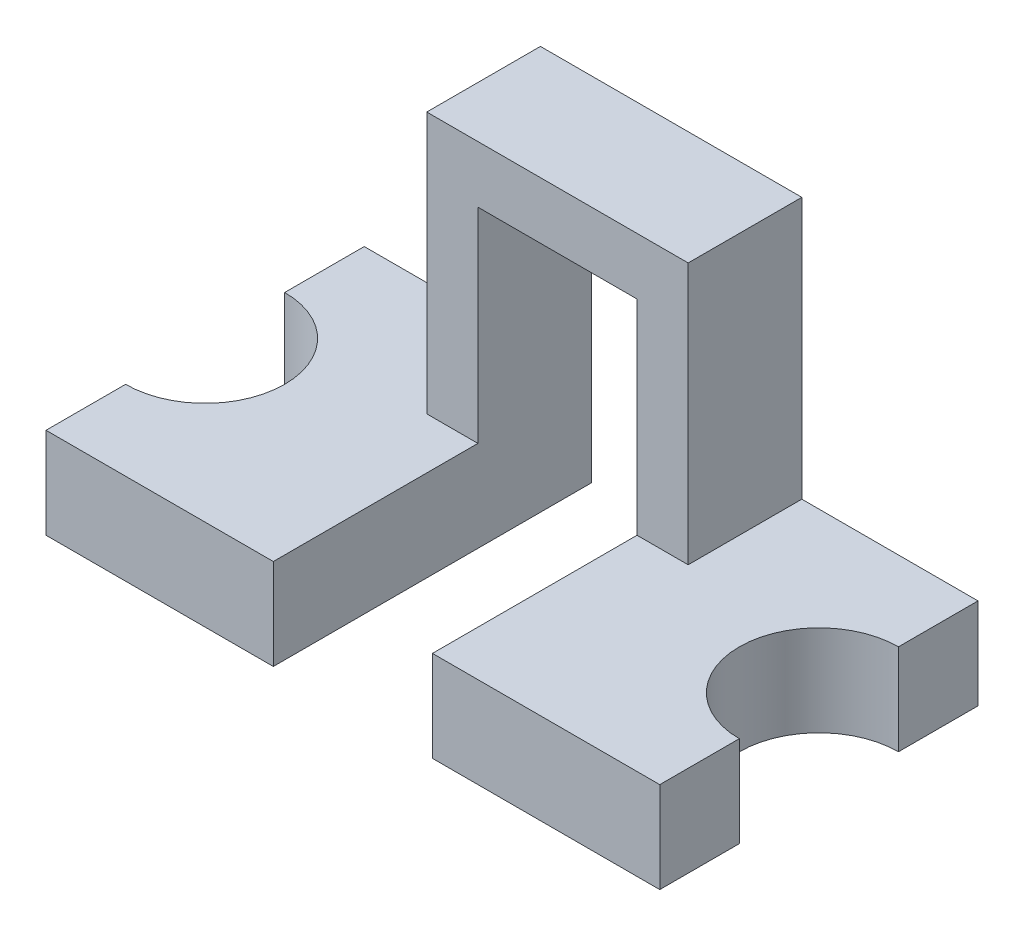
ISO-10303-21;
HEADER;
FILE_DESCRIPTION(('STEP AP214'),'2;1');
FILE_NAME('part.step','',(''),(''),'','','');
FILE_SCHEMA(('AUTOMOTIVE_DESIGN { 1 0 10303 214 1 1 1 1 }'));
ENDSEC;
DATA;
#1=APPLICATION_CONTEXT('core data for automotive mechanical design processes');
#2=APPLICATION_PROTOCOL_DEFINITION('international standard','automotive_design',2000,#1);
#3=PRODUCT_CONTEXT('',#1,'mechanical');
#4=PRODUCT('Part','Part','',(#3));
#5=PRODUCT_RELATED_PRODUCT_CATEGORY('part','',(#4));
#6=PRODUCT_DEFINITION_FORMATION('','',#4);
#7=PRODUCT_DEFINITION_CONTEXT('part definition',#1,'design');
#8=PRODUCT_DEFINITION('design','',#6,#7);
#9=PRODUCT_DEFINITION_SHAPE('','',#8);
#10=(LENGTH_UNIT() NAMED_UNIT(*) SI_UNIT(.MILLI.,.METRE.));
#11=(NAMED_UNIT(*) PLANE_ANGLE_UNIT() SI_UNIT($,.RADIAN.));
#12=(NAMED_UNIT(*) SI_UNIT($,.STERADIAN.) SOLID_ANGLE_UNIT());
#13=UNCERTAINTY_MEASURE_WITH_UNIT(LENGTH_MEASURE(1.E-05),#10,'distance_accuracy_value','');
#14=(GEOMETRIC_REPRESENTATION_CONTEXT(3) GLOBAL_UNCERTAINTY_ASSIGNED_CONTEXT((#13)) GLOBAL_UNIT_ASSIGNED_CONTEXT((#10,
#11,#12)) REPRESENTATION_CONTEXT('',''));
#15=CARTESIAN_POINT('',(0.,0.,0.));
#16=DIRECTION('',(0.,0.,1.));
#17=DIRECTION('',(1.,0.,0.));
#18=AXIS2_PLACEMENT_3D('',#15,#16,#17);
#19=CARTESIAN_POINT('',(7.,8.,0.));
#20=DIRECTION('',(1.,0.,0.));
#21=DIRECTION('',(0.,0.,-1.));
#22=AXIS2_PLACEMENT_3D('',#19,#20,#21);
#23=PLANE('',#22);
#24=DIRECTION('',(0.,0.,1.));
#25=VECTOR('',#24,1.);
#26=CARTESIAN_POINT('',(7.,0.,0.));
#27=LINE('',#26,#25);
#28=CARTESIAN_POINT('',(7.,0.,-28.));
#29=VERTEX_POINT('',#28);
#30=CARTESIAN_POINT('',(7.,0.,0.));
#31=VERTEX_POINT('',#30);
#32=EDGE_CURVE('E273',#29,#31,#27,.T.);
#33=ORIENTED_EDGE('',*,*,#32,.T.);
#34=DIRECTION('',(0.,-1.,0.));
#35=VECTOR('',#34,1.);
#36=CARTESIAN_POINT('',(7.,8.,0.));
#37=LINE('',#36,#35);
#38=CARTESIAN_POINT('',(7.,8.,0.));
#39=VERTEX_POINT('',#38);
#40=EDGE_CURVE('E11',#39,#31,#37,.T.);
#41=ORIENTED_EDGE('',*,*,#40,.F.);
#42=DIRECTION('',(0.,0.,1.));
#43=VECTOR('',#42,1.);
#44=CARTESIAN_POINT('',(7.,8.,0.));
#45=LINE('',#44,#43);
#46=CARTESIAN_POINT('',(7.,8.,-18.));
#47=VERTEX_POINT('',#46);
#48=EDGE_CURVE('E290',#47,#39,#45,.T.);
#49=ORIENTED_EDGE('',*,*,#48,.F.);
#50=DIRECTION('',(0.,1.,0.));
#51=VECTOR('',#50,1.);
#52=CARTESIAN_POINT('',(7.,8.,-18.));
#53=LINE('',#52,#51);
#54=CARTESIAN_POINT('',(7.,26.,-18.));
#55=VERTEX_POINT('',#54);
#56=EDGE_CURVE('E226',#47,#55,#53,.T.);
#57=ORIENTED_EDGE('',*,*,#56,.T.);
#58=DIRECTION('',(0.,0.,-1.));
#59=VECTOR('',#58,1.);
#60=CARTESIAN_POINT('',(7.,26.,-18.));
#61=LINE('',#60,#59);
#62=CARTESIAN_POINT('',(7.,26.,-28.));
#63=VERTEX_POINT('',#62);
#64=EDGE_CURVE('E256',#55,#63,#61,.T.);
#65=ORIENTED_EDGE('',*,*,#64,.T.);
#66=DIRECTION('',(0.,-1.,0.));
#67=VECTOR('',#66,1.);
#68=CARTESIAN_POINT('',(7.,8.,-28.));
#69=LINE('',#68,#67);
#70=EDGE_CURVE('E308',#63,#29,#69,.T.);
#71=ORIENTED_EDGE('',*,*,#70,.T.);
#72=EDGE_LOOP('',(#33,#41,#49,#57,#65,#71));
#73=FACE_BOUND('',#72,.T.);
#74=ADVANCED_FACE('F45',(#73),#23,.F.);
#75=CARTESIAN_POINT('',(7.,8.,0.));
#76=DIRECTION('',(0.,0.,-1.));
#77=DIRECTION('',(-1.,0.,0.));
#78=AXIS2_PLACEMENT_3D('',#75,#76,#77);
#79=PLANE('',#78);
#80=DIRECTION('',(1.,0.,0.));
#81=VECTOR('',#80,1.);
#82=CARTESIAN_POINT('',(7.,0.,0.));
#83=LINE('',#82,#81);
#84=CARTESIAN_POINT('',(27.,0.,0.));
#85=VERTEX_POINT('',#84);
#86=EDGE_CURVE('E312',#31,#85,#83,.T.);
#87=ORIENTED_EDGE('',*,*,#86,.T.);
#88=DIRECTION('',(0.,-1.,0.));
#89=VECTOR('',#88,1.);
#90=CARTESIAN_POINT('',(27.,8.,0.));
#91=LINE('',#90,#89);
#92=CARTESIAN_POINT('',(27.,8.,0.));
#93=VERTEX_POINT('',#92);
#94=EDGE_CURVE('E53',#93,#85,#91,.T.);
#95=ORIENTED_EDGE('',*,*,#94,.F.);
#96=DIRECTION('',(1.,0.,0.));
#97=VECTOR('',#96,1.);
#98=CARTESIAN_POINT('',(7.,8.,0.));
#99=LINE('',#98,#97);
#100=EDGE_CURVE('E293',#39,#93,#99,.T.);
#101=ORIENTED_EDGE('',*,*,#100,.F.);
#102=ORIENTED_EDGE('',*,*,#40,.T.);
#103=EDGE_LOOP('',(#87,#95,#101,#102));
#104=FACE_BOUND('',#103,.T.);
#105=ADVANCED_FACE('F367',(#104),#79,.F.);
#106=CARTESIAN_POINT('',(27.,8.,0.));
#107=DIRECTION('',(-1.,0.,0.));
#108=DIRECTION('',(0.,0.,1.));
#109=AXIS2_PLACEMENT_3D('',#106,#107,#108);
#110=PLANE('',#109);
#111=DIRECTION('',(0.,0.,-1.));
#112=VECTOR('',#111,1.);
#113=CARTESIAN_POINT('',(27.,0.,0.));
#114=LINE('',#113,#112);
#115=CARTESIAN_POINT('',(27.,0.,-7.));
#116=VERTEX_POINT('',#115);
#117=EDGE_CURVE('E315',#85,#116,#114,.T.);
#118=ORIENTED_EDGE('',*,*,#117,.T.);
#119=DIRECTION('',(0.,-1.,0.));
#120=VECTOR('',#119,1.);
#121=CARTESIAN_POINT('',(27.,8.,-7.));
#122=LINE('',#121,#120);
#123=CARTESIAN_POINT('',(27.,8.,-7.));
#124=VERTEX_POINT('',#123);
#125=EDGE_CURVE('E337',#124,#116,#122,.T.);
#126=ORIENTED_EDGE('',*,*,#125,.F.);
#127=DIRECTION('',(0.,0.,-1.));
#128=VECTOR('',#127,1.);
#129=CARTESIAN_POINT('',(27.,8.,0.));
#130=LINE('',#129,#128);
#131=EDGE_CURVE('E297',#93,#124,#130,.T.);
#132=ORIENTED_EDGE('',*,*,#131,.F.);
#133=ORIENTED_EDGE('',*,*,#94,.T.);
#134=EDGE_LOOP('',(#118,#126,#132,#133));
#135=FACE_BOUND('',#134,.T.);
#136=ADVANCED_FACE('F346',(#135),#110,.F.);
#137=CARTESIAN_POINT('',(27.,8.,-14.));
#138=DIRECTION('',(0.,-1.,0.));
#139=DIRECTION('',(0.,0.,-1.));
#140=AXIS2_PLACEMENT_3D('',#137,#138,#139);
#141=CYLINDRICAL_SURFACE('',#140,7.);
#142=CARTESIAN_POINT('',(27.,0.,-14.));
#143=DIRECTION('',(0.,-1.,0.));
#144=DIRECTION('',(0.,0.,1.));
#145=AXIS2_PLACEMENT_3D('',#142,#143,#144);
#146=CIRCLE('',#145,7.);
#147=CARTESIAN_POINT('',(27.,0.,-21.));
#148=VERTEX_POINT('',#147);
#149=EDGE_CURVE('E318',#116,#148,#146,.T.);
#150=ORIENTED_EDGE('',*,*,#149,.T.);
#151=DIRECTION('',(0.,-1.,0.));
#152=VECTOR('',#151,1.);
#153=CARTESIAN_POINT('',(27.,8.,-21.));
#154=LINE('',#153,#152);
#155=CARTESIAN_POINT('',(27.,8.,-21.));
#156=VERTEX_POINT('',#155);
#157=EDGE_CURVE('E333',#156,#148,#154,.T.);
#158=ORIENTED_EDGE('',*,*,#157,.F.);
#159=CARTESIAN_POINT('',(27.,8.,-14.));
#160=DIRECTION('',(0.,-1.,0.));
#161=DIRECTION('',(0.,0.,1.));
#162=AXIS2_PLACEMENT_3D('',#159,#160,#161);
#163=CIRCLE('',#162,7.);
#164=EDGE_CURVE('E300',#124,#156,#163,.T.);
#165=ORIENTED_EDGE('',*,*,#164,.F.);
#166=ORIENTED_EDGE('',*,*,#125,.T.);
#167=EDGE_LOOP('',(#150,#158,#165,#166));
#168=FACE_BOUND('',#167,.T.);
#169=ADVANCED_FACE('F358',(#168),#141,.F.);
#170=CARTESIAN_POINT('',(27.,8.,-21.));
#171=DIRECTION('',(-1.,0.,0.));
#172=DIRECTION('',(0.,0.,1.));
#173=AXIS2_PLACEMENT_3D('',#170,#171,#172);
#174=PLANE('',#173);
#175=DIRECTION('',(0.,0.,-1.));
#176=VECTOR('',#175,1.);
#177=CARTESIAN_POINT('',(27.,0.,-21.));
#178=LINE('',#177,#176);
#179=CARTESIAN_POINT('',(27.,0.,-28.));
#180=VERTEX_POINT('',#179);
#181=EDGE_CURVE('E321',#148,#180,#178,.T.);
#182=ORIENTED_EDGE('',*,*,#181,.T.);
#183=DIRECTION('',(0.,-1.,0.));
#184=VECTOR('',#183,1.);
#185=CARTESIAN_POINT('',(27.,8.,-28.));
#186=LINE('',#185,#184);
#187=CARTESIAN_POINT('',(27.,8.,-28.));
#188=VERTEX_POINT('',#187);
#189=EDGE_CURVE('E329',#188,#180,#186,.T.);
#190=ORIENTED_EDGE('',*,*,#189,.F.);
#191=DIRECTION('',(0.,0.,-1.));
#192=VECTOR('',#191,1.);
#193=CARTESIAN_POINT('',(27.,8.,-21.));
#194=LINE('',#193,#192);
#195=EDGE_CURVE('E303',#156,#188,#194,.T.);
#196=ORIENTED_EDGE('',*,*,#195,.F.);
#197=ORIENTED_EDGE('',*,*,#157,.T.);
#198=EDGE_LOOP('',(#182,#190,#196,#197));
#199=FACE_BOUND('',#198,.T.);
#200=ADVANCED_FACE('F362',(#199),#174,.F.);
#201=CARTESIAN_POINT('',(7.,8.,-28.));
#202=DIRECTION('',(0.,0.,1.));
#203=DIRECTION('',(1.,0.,0.));
#204=AXIS2_PLACEMENT_3D('',#201,#202,#203);
#205=PLANE('',#204);
#206=DIRECTION('',(-1.,0.,0.));
#207=VECTOR('',#206,1.);
#208=CARTESIAN_POINT('',(7.,0.,-28.));
#209=LINE('',#208,#207);
#210=EDGE_CURVE('E294',#180,#29,#209,.T.);
#211=ORIENTED_EDGE('',*,*,#210,.T.);
#212=ORIENTED_EDGE('',*,*,#70,.F.);
#213=DIRECTION('',(-1.,0.,0.));
#214=VECTOR('',#213,1.);
#215=CARTESIAN_POINT('',(7.,26.,-28.));
#216=LINE('',#215,#214);
#217=CARTESIAN_POINT('',(-7.,26.,-28.));
#218=VERTEX_POINT('',#217);
#219=EDGE_CURVE('E198',#63,#218,#216,.T.);
#220=ORIENTED_EDGE('',*,*,#219,.T.);
#221=DIRECTION('',(0.,-1.,0.));
#222=VECTOR('',#221,1.);
#223=CARTESIAN_POINT('',(-7.00000000000013,8.,-28.));
#224=LINE('',#223,#222);
#225=CARTESIAN_POINT('',(-7.,0.,-28.));
#226=VERTEX_POINT('',#225);
#227=EDGE_CURVE('E203',#218,#226,#224,.T.);
#228=ORIENTED_EDGE('',*,*,#227,.T.);
#229=DIRECTION('',(-1.,0.,0.));
#230=VECTOR('',#229,1.);
#231=CARTESIAN_POINT('',(-7.,0.,-28.));
#232=LINE('',#231,#230);
#233=CARTESIAN_POINT('',(-27.,0.,-28.));
#234=VERTEX_POINT('',#233);
#235=EDGE_CURVE('E181',#226,#234,#232,.T.);
#236=ORIENTED_EDGE('',*,*,#235,.T.);
#237=DIRECTION('',(0.,-1.,0.));
#238=VECTOR('',#237,1.);
#239=CARTESIAN_POINT('',(-27.,8.,-28.));
#240=LINE('',#239,#238);
#241=CARTESIAN_POINT('',(-27.,8.,-28.));
#242=VERTEX_POINT('',#241);
#243=EDGE_CURVE('E176',#242,#234,#240,.T.);
#244=ORIENTED_EDGE('',*,*,#243,.F.);
#245=DIRECTION('',(-1.,0.,0.));
#246=VECTOR('',#245,1.);
#247=CARTESIAN_POINT('',(-7.,8.,-28.));
#248=LINE('',#247,#246);
#249=CARTESIAN_POINT('',(-11.5,8.,-28.));
#250=VERTEX_POINT('',#249);
#251=EDGE_CURVE('E211',#250,#242,#248,.T.);
#252=ORIENTED_EDGE('',*,*,#251,.F.);
#253=DIRECTION('',(0.,1.,0.));
#254=VECTOR('',#253,1.);
#255=CARTESIAN_POINT('',(-11.5,8.,-28.));
#256=LINE('',#255,#254);
#257=CARTESIAN_POINT('',(-11.5,30.9999999999999,-28.));
#258=VERTEX_POINT('',#257);
#259=EDGE_CURVE('E260',#250,#258,#256,.T.);
#260=ORIENTED_EDGE('',*,*,#259,.T.);
#261=DIRECTION('',(1.,0.,0.));
#262=VECTOR('',#261,1.);
#263=CARTESIAN_POINT('',(11.5,30.9999999999999,-28.));
#264=LINE('',#263,#262);
#265=CARTESIAN_POINT('',(11.5,30.9999999999999,-28.));
#266=VERTEX_POINT('',#265);
#267=EDGE_CURVE('E264',#258,#266,#264,.T.);
#268=ORIENTED_EDGE('',*,*,#267,.T.);
#269=DIRECTION('',(0.,-1.,0.));
#270=VECTOR('',#269,1.);
#271=CARTESIAN_POINT('',(11.5,8.,-28.));
#272=LINE('',#271,#270);
#273=CARTESIAN_POINT('',(11.5,8.,-28.));
#274=VERTEX_POINT('',#273);
#275=EDGE_CURVE('E231',#266,#274,#272,.T.);
#276=ORIENTED_EDGE('',*,*,#275,.T.);
#277=DIRECTION('',(-1.,0.,0.));
#278=VECTOR('',#277,1.);
#279=CARTESIAN_POINT('',(7.,8.,-28.));
#280=LINE('',#279,#278);
#281=EDGE_CURVE('E65',#188,#274,#280,.T.);
#282=ORIENTED_EDGE('',*,*,#281,.F.);
#283=ORIENTED_EDGE('',*,*,#189,.T.);
#284=EDGE_LOOP('',(#211,#212,#220,#228,#236,#244,#252,#260,#268,#276,#282,#283));
#285=FACE_BOUND('',#284,.T.);
#286=ADVANCED_FACE('F371',(#285),#205,.F.);
#287=CARTESIAN_POINT('',(27.,8.,-14.));
#288=DIRECTION('',(0.,1.,0.));
#289=DIRECTION('',(0.,0.,1.));
#290=AXIS2_PLACEMENT_3D('',#287,#288,#289);
#291=PLANE('',#290);
#292=DIRECTION('',(0.,0.,-1.));
#293=VECTOR('',#292,1.);
#294=CARTESIAN_POINT('',(11.5,8.,-18.));
#295=LINE('',#294,#293);
#296=CARTESIAN_POINT('',(11.5,8.,-18.));
#297=VERTEX_POINT('',#296);
#298=EDGE_CURVE('E60',#297,#274,#295,.T.);
#299=ORIENTED_EDGE('',*,*,#298,.F.);
#300=DIRECTION('',(-1.,0.,0.));
#301=VECTOR('',#300,1.);
#302=CARTESIAN_POINT('',(7.,8.,-18.));
#303=LINE('',#302,#301);
#304=EDGE_CURVE('E254',#297,#47,#303,.T.);
#305=ORIENTED_EDGE('',*,*,#304,.T.);
#306=ORIENTED_EDGE('',*,*,#48,.T.);
#307=ORIENTED_EDGE('',*,*,#100,.T.);
#308=ORIENTED_EDGE('',*,*,#131,.T.);
#309=ORIENTED_EDGE('',*,*,#164,.T.);
#310=ORIENTED_EDGE('',*,*,#195,.T.);
#311=ORIENTED_EDGE('',*,*,#281,.T.);
#312=EDGE_LOOP('',(#299,#305,#306,#307,#308,#309,#310,#311));
#313=FACE_BOUND('',#312,.T.);
#314=ADVANCED_FACE('F364',(#313),#291,.T.);
#315=CARTESIAN_POINT('',(27.,0.,-14.));
#316=DIRECTION('',(0.,1.,0.));
#317=DIRECTION('',(0.,0.,1.));
#318=AXIS2_PLACEMENT_3D('',#315,#316,#317);
#319=PLANE('',#318);
#320=ORIENTED_EDGE('',*,*,#32,.F.);
#321=ORIENTED_EDGE('',*,*,#210,.F.);
#322=ORIENTED_EDGE('',*,*,#181,.F.);
#323=ORIENTED_EDGE('',*,*,#149,.F.);
#324=ORIENTED_EDGE('',*,*,#117,.F.);
#325=ORIENTED_EDGE('',*,*,#86,.F.);
#326=EDGE_LOOP('',(#320,#321,#322,#323,#324,#325));
#327=FACE_BOUND('',#326,.T.);
#328=ADVANCED_FACE('F353',(#327),#319,.F.);
#329=CARTESIAN_POINT('',(11.5,8.,-18.));
#330=DIRECTION('',(1.,0.,0.));
#331=DIRECTION('',(0.,0.,-1.));
#332=AXIS2_PLACEMENT_3D('',#329,#330,#331);
#333=PLANE('',#332);
#334=ORIENTED_EDGE('',*,*,#275,.F.);
#335=DIRECTION('',(0.,0.,-1.));
#336=VECTOR('',#335,1.);
#337=CARTESIAN_POINT('',(11.5,30.9999999999999,-18.));
#338=LINE('',#337,#336);
#339=CARTESIAN_POINT('',(11.5,30.9999999999999,-18.));
#340=VERTEX_POINT('',#339);
#341=EDGE_CURVE('E274',#340,#266,#338,.T.);
#342=ORIENTED_EDGE('',*,*,#341,.F.);
#343=DIRECTION('',(0.,-1.,0.));
#344=VECTOR('',#343,1.);
#345=CARTESIAN_POINT('',(11.5,8.,-18.));
#346=LINE('',#345,#344);
#347=EDGE_CURVE('E251',#340,#297,#346,.T.);
#348=ORIENTED_EDGE('',*,*,#347,.T.);
#349=ORIENTED_EDGE('',*,*,#298,.T.);
#350=EDGE_LOOP('',(#334,#342,#348,#349));
#351=FACE_BOUND('',#350,.T.);
#352=ADVANCED_FACE('F375',(#351),#333,.T.);
#353=CARTESIAN_POINT('',(11.5,30.9999999999999,-18.));
#354=DIRECTION('',(0.,1.,0.));
#355=DIRECTION('',(0.,0.,1.));
#356=AXIS2_PLACEMENT_3D('',#353,#354,#355);
#357=PLANE('',#356);
#358=ORIENTED_EDGE('',*,*,#267,.F.);
#359=DIRECTION('',(0.,0.,-1.));
#360=VECTOR('',#359,1.);
#361=CARTESIAN_POINT('',(-11.5,30.9999999999999,-18.));
#362=LINE('',#361,#360);
#363=CARTESIAN_POINT('',(-11.5,30.9999999999999,-18.));
#364=VERTEX_POINT('',#363);
#365=EDGE_CURVE('E277',#364,#258,#362,.T.);
#366=ORIENTED_EDGE('',*,*,#365,.F.);
#367=DIRECTION('',(1.,0.,0.));
#368=VECTOR('',#367,1.);
#369=CARTESIAN_POINT('',(11.5,30.9999999999999,-18.));
#370=LINE('',#369,#368);
#371=EDGE_CURVE('E247',#364,#340,#370,.T.);
#372=ORIENTED_EDGE('',*,*,#371,.T.);
#373=ORIENTED_EDGE('',*,*,#341,.T.);
#374=EDGE_LOOP('',(#358,#366,#372,#373));
#375=FACE_BOUND('',#374,.T.);
#376=ADVANCED_FACE('F425',(#375),#357,.T.);
#377=CARTESIAN_POINT('',(-11.5,8.,-18.));
#378=DIRECTION('',(-1.,0.,0.));
#379=DIRECTION('',(0.,0.,1.));
#380=AXIS2_PLACEMENT_3D('',#377,#378,#379);
#381=PLANE('',#380);
#382=ORIENTED_EDGE('',*,*,#259,.F.);
#383=DIRECTION('',(0.,0.,-1.));
#384=VECTOR('',#383,1.);
#385=CARTESIAN_POINT('',(-11.5,8.,-18.));
#386=LINE('',#385,#384);
#387=CARTESIAN_POINT('',(-11.5,8.,-18.));
#388=VERTEX_POINT('',#387);
#389=EDGE_CURVE('E280',#388,#250,#386,.T.);
#390=ORIENTED_EDGE('',*,*,#389,.F.);
#391=DIRECTION('',(0.,1.,0.));
#392=VECTOR('',#391,1.);
#393=CARTESIAN_POINT('',(-11.5,8.,-18.));
#394=LINE('',#393,#392);
#395=EDGE_CURVE('E243',#388,#364,#394,.T.);
#396=ORIENTED_EDGE('',*,*,#395,.T.);
#397=ORIENTED_EDGE('',*,*,#365,.T.);
#398=EDGE_LOOP('',(#382,#390,#396,#397));
#399=FACE_BOUND('',#398,.T.);
#400=ADVANCED_FACE('F423',(#399),#381,.T.);
#401=CARTESIAN_POINT('',(-7.00000000000013,8.,-18.));
#402=DIRECTION('',(1.,0.,0.));
#403=DIRECTION('',(0.,1.,0.));
#404=AXIS2_PLACEMENT_3D('',#401,#402,#403);
#405=PLANE('',#404);
#406=ORIENTED_EDGE('',*,*,#227,.F.);
#407=DIRECTION('',(0.,0.,-1.));
#408=VECTOR('',#407,1.);
#409=CARTESIAN_POINT('',(-7.,26.,-18.));
#410=LINE('',#409,#408);
#411=CARTESIAN_POINT('',(-7.,26.,-18.));
#412=VERTEX_POINT('',#411);
#413=EDGE_CURVE('E284',#412,#218,#410,.T.);
#414=ORIENTED_EDGE('',*,*,#413,.F.);
#415=DIRECTION('',(0.,-1.,0.));
#416=VECTOR('',#415,1.);
#417=CARTESIAN_POINT('',(-7.00000000000013,8.,-18.));
#418=LINE('',#417,#416);
#419=CARTESIAN_POINT('',(-7.00000000000013,8.,-18.));
#420=VERTEX_POINT('',#419);
#421=EDGE_CURVE('E235',#412,#420,#418,.T.);
#422=ORIENTED_EDGE('',*,*,#421,.T.);
#423=DIRECTION('',(0.,0.,-1.));
#424=VECTOR('',#423,1.);
#425=CARTESIAN_POINT('',(-7.,8.,0.));
#426=LINE('',#425,#424);
#427=CARTESIAN_POINT('',(-7.,8.,0.));
#428=VERTEX_POINT('',#427);
#429=EDGE_CURVE('E214',#428,#420,#426,.T.);
#430=ORIENTED_EDGE('',*,*,#429,.F.);
#431=DIRECTION('',(0.,-1.,0.));
#432=VECTOR('',#431,1.);
#433=CARTESIAN_POINT('',(-7.,8.,0.));
#434=LINE('',#433,#432);
#435=CARTESIAN_POINT('',(-7.,0.,0.));
#436=VERTEX_POINT('',#435);
#437=EDGE_CURVE('E395',#428,#436,#434,.T.);
#438=ORIENTED_EDGE('',*,*,#437,.T.);
#439=DIRECTION('',(0.,0.,-1.));
#440=VECTOR('',#439,1.);
#441=CARTESIAN_POINT('',(-7.,0.,0.));
#442=LINE('',#441,#440);
#443=EDGE_CURVE('E391',#436,#226,#442,.T.);
#444=ORIENTED_EDGE('',*,*,#443,.T.);
#445=EDGE_LOOP('',(#406,#414,#422,#430,#438,#444));
#446=FACE_BOUND('',#445,.T.);
#447=ADVANCED_FACE('F392',(#446),#405,.T.);
#448=CARTESIAN_POINT('',(7.,26.,-18.));
#449=DIRECTION('',(0.,-1.,0.));
#450=DIRECTION('',(0.,0.,-1.));
#451=AXIS2_PLACEMENT_3D('',#448,#449,#450);
#452=PLANE('',#451);
#453=ORIENTED_EDGE('',*,*,#219,.F.);
#454=ORIENTED_EDGE('',*,*,#64,.F.);
#455=DIRECTION('',(-1.,0.,0.));
#456=VECTOR('',#455,1.);
#457=CARTESIAN_POINT('',(7.,26.,-18.));
#458=LINE('',#457,#456);
#459=EDGE_CURVE('E230',#55,#412,#458,.T.);
#460=ORIENTED_EDGE('',*,*,#459,.T.);
#461=ORIENTED_EDGE('',*,*,#413,.T.);
#462=EDGE_LOOP('',(#453,#454,#460,#461));
#463=FACE_BOUND('',#462,.T.);
#464=ADVANCED_FACE('F385',(#463),#452,.T.);
#465=CARTESIAN_POINT('',(0.,0.,-18.));
#466=DIRECTION('',(0.,0.,1.));
#467=DIRECTION('',(1.,0.,0.));
#468=AXIS2_PLACEMENT_3D('',#465,#466,#467);
#469=PLANE('',#468);
#470=ORIENTED_EDGE('',*,*,#56,.F.);
#471=ORIENTED_EDGE('',*,*,#304,.F.);
#472=ORIENTED_EDGE('',*,*,#347,.F.);
#473=ORIENTED_EDGE('',*,*,#371,.F.);
#474=ORIENTED_EDGE('',*,*,#395,.F.);
#475=DIRECTION('',(-1.,0.,0.));
#476=VECTOR('',#475,1.);
#477=CARTESIAN_POINT('',(-7.00000000000013,8.,-18.));
#478=LINE('',#477,#476);
#479=EDGE_CURVE('E239',#420,#388,#478,.T.);
#480=ORIENTED_EDGE('',*,*,#479,.F.);
#481=ORIENTED_EDGE('',*,*,#421,.F.);
#482=ORIENTED_EDGE('',*,*,#459,.F.);
#483=EDGE_LOOP('',(#470,#471,#472,#473,#474,#480,#481,#482));
#484=FACE_BOUND('',#483,.T.);
#485=ADVANCED_FACE('F380',(#484),#469,.T.);
#486=CARTESIAN_POINT('',(-27.,8.,-14.));
#487=DIRECTION('',(0.,-1.,0.));
#488=DIRECTION('',(0.,0.,-1.));
#489=AXIS2_PLACEMENT_3D('',#486,#487,#488);
#490=CYLINDRICAL_SURFACE('',#489,7.);
#491=CARTESIAN_POINT('',(-27.,0.,-14.));
#492=DIRECTION('',(0.,-1.,0.));
#493=DIRECTION('',(0.,0.,-1.));
#494=AXIS2_PLACEMENT_3D('',#491,#492,#493);
#495=CIRCLE('',#494,7.);
#496=CARTESIAN_POINT('',(-27.,0.,-21.));
#497=VERTEX_POINT('',#496);
#498=CARTESIAN_POINT('',(-27.,0.,-7.));
#499=VERTEX_POINT('',#498);
#500=EDGE_CURVE('E188',#497,#499,#495,.T.);
#501=ORIENTED_EDGE('',*,*,#500,.T.);
#502=DIRECTION('',(0.,-1.,0.));
#503=VECTOR('',#502,1.);
#504=CARTESIAN_POINT('',(-27.,8.,-7.));
#505=LINE('',#504,#503);
#506=CARTESIAN_POINT('',(-27.,8.,-7.));
#507=VERTEX_POINT('',#506);
#508=EDGE_CURVE('E409',#507,#499,#505,.T.);
#509=ORIENTED_EDGE('',*,*,#508,.F.);
#510=CARTESIAN_POINT('',(-27.,8.,-14.));
#511=DIRECTION('',(0.,-1.,0.));
#512=DIRECTION('',(0.,0.,-1.));
#513=AXIS2_PLACEMENT_3D('',#510,#511,#512);
#514=CIRCLE('',#513,7.);
#515=CARTESIAN_POINT('',(-27.,8.,-21.));
#516=VERTEX_POINT('',#515);
#517=EDGE_CURVE('E182',#516,#507,#514,.T.);
#518=ORIENTED_EDGE('',*,*,#517,.F.);
#519=DIRECTION('',(0.,-1.,0.));
#520=VECTOR('',#519,1.);
#521=CARTESIAN_POINT('',(-27.,8.,-21.));
#522=LINE('',#521,#520);
#523=EDGE_CURVE('E173',#516,#497,#522,.T.);
#524=ORIENTED_EDGE('',*,*,#523,.T.);
#525=EDGE_LOOP('',(#501,#509,#518,#524));
#526=FACE_BOUND('',#525,.T.);
#527=ADVANCED_FACE('F186',(#526),#490,.F.);
#528=CARTESIAN_POINT('',(-27.,8.,0.));
#529=DIRECTION('',(1.,0.,0.));
#530=DIRECTION('',(0.,0.,-1.));
#531=AXIS2_PLACEMENT_3D('',#528,#529,#530);
#532=PLANE('',#531);
#533=DIRECTION('',(0.,0.,1.));
#534=VECTOR('',#533,1.);
#535=CARTESIAN_POINT('',(-27.,0.,0.));
#536=LINE('',#535,#534);
#537=CARTESIAN_POINT('',(-27.,0.,0.));
#538=VERTEX_POINT('',#537);
#539=EDGE_CURVE('E195',#499,#538,#536,.T.);
#540=ORIENTED_EDGE('',*,*,#539,.T.);
#541=DIRECTION('',(0.,-1.,0.));
#542=VECTOR('',#541,1.);
#543=CARTESIAN_POINT('',(-27.,8.,0.));
#544=LINE('',#543,#542);
#545=CARTESIAN_POINT('',(-27.,8.,0.));
#546=VERTEX_POINT('',#545);
#547=EDGE_CURVE('E406',#546,#538,#544,.T.);
#548=ORIENTED_EDGE('',*,*,#547,.F.);
#549=DIRECTION('',(0.,0.,1.));
#550=VECTOR('',#549,1.);
#551=CARTESIAN_POINT('',(-27.,8.,0.));
#552=LINE('',#551,#550);
#553=EDGE_CURVE('E221',#507,#546,#552,.T.);
#554=ORIENTED_EDGE('',*,*,#553,.F.);
#555=ORIENTED_EDGE('',*,*,#508,.T.);
#556=EDGE_LOOP('',(#540,#548,#554,#555));
#557=FACE_BOUND('',#556,.T.);
#558=ADVANCED_FACE('F417',(#557),#532,.F.);
#559=CARTESIAN_POINT('',(-7.,8.,0.));
#560=DIRECTION('',(0.,0.,-1.));
#561=DIRECTION('',(-1.,0.,0.));
#562=AXIS2_PLACEMENT_3D('',#559,#560,#561);
#563=PLANE('',#562);
#564=DIRECTION('',(1.,0.,0.));
#565=VECTOR('',#564,1.);
#566=CARTESIAN_POINT('',(-7.,0.,0.));
#567=LINE('',#566,#565);
#568=EDGE_CURVE('E205',#538,#436,#567,.T.);
#569=ORIENTED_EDGE('',*,*,#568,.T.);
#570=ORIENTED_EDGE('',*,*,#437,.F.);
#571=DIRECTION('',(1.,0.,0.));
#572=VECTOR('',#571,1.);
#573=CARTESIAN_POINT('',(-7.,8.,0.));
#574=LINE('',#573,#572);
#575=EDGE_CURVE('E218',#546,#428,#574,.T.);
#576=ORIENTED_EDGE('',*,*,#575,.F.);
#577=ORIENTED_EDGE('',*,*,#547,.T.);
#578=EDGE_LOOP('',(#569,#570,#576,#577));
#579=FACE_BOUND('',#578,.T.);
#580=ADVANCED_FACE('F403',(#579),#563,.F.);
#581=CARTESIAN_POINT('',(-27.,8.,-21.));
#582=DIRECTION('',(1.,0.,0.));
#583=DIRECTION('',(0.,0.,-1.));
#584=AXIS2_PLACEMENT_3D('',#581,#582,#583);
#585=PLANE('',#584);
#586=DIRECTION('',(0.,0.,1.));
#587=VECTOR('',#586,1.);
#588=CARTESIAN_POINT('',(-27.,0.,-21.));
#589=LINE('',#588,#587);
#590=EDGE_CURVE('E169',#234,#497,#589,.T.);
#591=ORIENTED_EDGE('',*,*,#590,.T.);
#592=ORIENTED_EDGE('',*,*,#523,.F.);
#593=DIRECTION('',(0.,0.,1.));
#594=VECTOR('',#593,1.);
#595=CARTESIAN_POINT('',(-27.,8.,-21.));
#596=LINE('',#595,#594);
#597=EDGE_CURVE('E191',#242,#516,#596,.T.);
#598=ORIENTED_EDGE('',*,*,#597,.F.);
#599=ORIENTED_EDGE('',*,*,#243,.T.);
#600=EDGE_LOOP('',(#591,#592,#598,#599));
#601=FACE_BOUND('',#600,.T.);
#602=ADVANCED_FACE('F171',(#601),#585,.F.);
#603=CARTESIAN_POINT('',(-27.,8.,-14.));
#604=DIRECTION('',(0.,-1.,0.));
#605=DIRECTION('',(0.,0.,-1.));
#606=AXIS2_PLACEMENT_3D('',#603,#604,#605);
#607=PLANE('',#606);
#608=ORIENTED_EDGE('',*,*,#389,.T.);
#609=ORIENTED_EDGE('',*,*,#251,.T.);
#610=ORIENTED_EDGE('',*,*,#597,.T.);
#611=ORIENTED_EDGE('',*,*,#517,.T.);
#612=ORIENTED_EDGE('',*,*,#553,.T.);
#613=ORIENTED_EDGE('',*,*,#575,.T.);
#614=ORIENTED_EDGE('',*,*,#429,.T.);
#615=ORIENTED_EDGE('',*,*,#479,.T.);
#616=EDGE_LOOP('',(#608,#609,#610,#611,#612,#613,#614,#615));
#617=FACE_BOUND('',#616,.T.);
#618=ADVANCED_FACE('F419',(#617),#607,.F.);
#619=CARTESIAN_POINT('',(-27.,0.,-14.));
#620=DIRECTION('',(0.,-1.,0.));
#621=DIRECTION('',(0.,0.,-1.));
#622=AXIS2_PLACEMENT_3D('',#619,#620,#621);
#623=PLANE('',#622);
#624=ORIENTED_EDGE('',*,*,#500,.F.);
#625=ORIENTED_EDGE('',*,*,#590,.F.);
#626=ORIENTED_EDGE('',*,*,#235,.F.);
#627=ORIENTED_EDGE('',*,*,#443,.F.);
#628=ORIENTED_EDGE('',*,*,#568,.F.);
#629=ORIENTED_EDGE('',*,*,#539,.F.);
#630=EDGE_LOOP('',(#624,#625,#626,#627,#628,#629));
#631=FACE_BOUND('',#630,.T.);
#632=ADVANCED_FACE('F193',(#631),#623,.T.);
#633=CLOSED_SHELL('',(#74,#105,#136,#169,#200,#286,#314,#328,#352,#376,#400,#447,#464,#485,#527,
#558,#580,#602,#618,#632));
#634=MANIFOLD_SOLID_BREP('B2',#633);
#635=ADVANCED_BREP_SHAPE_REPRESENTATION('',(#18,#634),#14);
#636=SHAPE_DEFINITION_REPRESENTATION(#9,#635);
ENDSEC;
END-ISO-10303-21;
